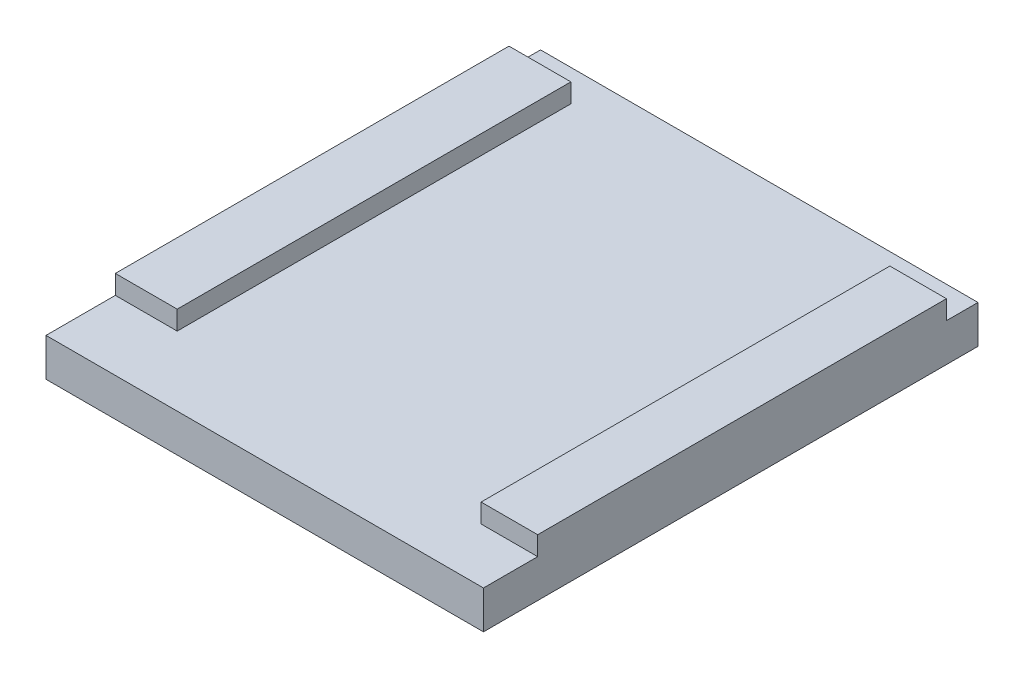
ISO-10303-21;
HEADER;
FILE_DESCRIPTION(('STEP AP214'),'2;1');
FILE_NAME('part.step','',(''),(''),'','','');
FILE_SCHEMA(('AUTOMOTIVE_DESIGN { 1 0 10303 214 1 1 1 1 }'));
ENDSEC;
DATA;
#1=APPLICATION_CONTEXT('core data for automotive mechanical design processes');
#2=APPLICATION_PROTOCOL_DEFINITION('international standard','automotive_design',2000,#1);
#3=PRODUCT_CONTEXT('',#1,'mechanical');
#4=PRODUCT('Part','Part','',(#3));
#5=PRODUCT_RELATED_PRODUCT_CATEGORY('part','',(#4));
#6=PRODUCT_DEFINITION_FORMATION('','',#4);
#7=PRODUCT_DEFINITION_CONTEXT('part definition',#1,'design');
#8=PRODUCT_DEFINITION('design','',#6,#7);
#9=PRODUCT_DEFINITION_SHAPE('','',#8);
#10=(LENGTH_UNIT() NAMED_UNIT(*) SI_UNIT(.MILLI.,.METRE.));
#11=(NAMED_UNIT(*) PLANE_ANGLE_UNIT() SI_UNIT($,.RADIAN.));
#12=(NAMED_UNIT(*) SI_UNIT($,.STERADIAN.) SOLID_ANGLE_UNIT());
#13=UNCERTAINTY_MEASURE_WITH_UNIT(LENGTH_MEASURE(1.E-05),#10,'distance_accuracy_value','');
#14=(GEOMETRIC_REPRESENTATION_CONTEXT(3) GLOBAL_UNCERTAINTY_ASSIGNED_CONTEXT((#13)) GLOBAL_UNIT_ASSIGNED_CONTEXT((#10,
#11,#12)) REPRESENTATION_CONTEXT('',''));
#15=CARTESIAN_POINT('',(0.,0.,0.));
#16=DIRECTION('',(0.,0.,1.));
#17=DIRECTION('',(1.,0.,0.));
#18=AXIS2_PLACEMENT_3D('',#15,#16,#17);
#19=CARTESIAN_POINT('',(0.,2.,0.));
#20=DIRECTION('',(0.,1.,0.));
#21=DIRECTION('',(0.,0.,1.));
#22=AXIS2_PLACEMENT_3D('',#19,#20,#21);
#23=PLANE('',#22);
#24=DIRECTION('',(0.,0.,1.));
#25=VECTOR('',#24,1.);
#26=CARTESIAN_POINT('',(20.0263343718205,2.,1.65880729446885));
#27=LINE('',#26,#25);
#28=CARTESIAN_POINT('',(20.0263343718205,2.,1.65880729446885));
#29=VERTEX_POINT('',#28);
#30=CARTESIAN_POINT('',(20.0263343718205,2.,23.1498418754959));
#31=VERTEX_POINT('',#30);
#32=EDGE_CURVE('E358',#29,#31,#27,.T.);
#33=ORIENTED_EDGE('',*,*,#32,.F.);
#34=DIRECTION('',(-1.,0.,0.));
#35=VECTOR('',#34,1.);
#36=CARTESIAN_POINT('',(23.,2.,1.65880729446885));
#37=LINE('',#36,#35);
#38=CARTESIAN_POINT('',(23.,2.,1.65880729446885));
#39=VERTEX_POINT('',#38);
#40=EDGE_CURVE('E364',#39,#29,#37,.T.);
#41=ORIENTED_EDGE('',*,*,#40,.F.);
#42=DIRECTION('',(0.,0.,-1.));
#43=VECTOR('',#42,1.);
#44=CARTESIAN_POINT('',(23.,2.,0.));
#45=LINE('',#44,#43);
#46=CARTESIAN_POINT('',(23.,2.,0.));
#47=VERTEX_POINT('',#46);
#48=EDGE_CURVE('E146',#39,#47,#45,.T.);
#49=ORIENTED_EDGE('',*,*,#48,.T.);
#50=DIRECTION('',(-1.,0.,0.));
#51=VECTOR('',#50,1.);
#52=CARTESIAN_POINT('',(0.,2.,0.));
#53=LINE('',#52,#51);
#54=CARTESIAN_POINT('',(0.,2.,0.));
#55=VERTEX_POINT('',#54);
#56=EDGE_CURVE('E187',#47,#55,#53,.T.);
#57=ORIENTED_EDGE('',*,*,#56,.T.);
#58=DIRECTION('',(0.,0.,1.));
#59=VECTOR('',#58,1.);
#60=CARTESIAN_POINT('',(0.,2.,0.));
#61=LINE('',#60,#59);
#62=CARTESIAN_POINT('',(0.,2.,1.65880729446884));
#63=VERTEX_POINT('',#62);
#64=EDGE_CURVE('E179',#55,#63,#61,.T.);
#65=ORIENTED_EDGE('',*,*,#64,.T.);
#66=DIRECTION('',(-1.,0.,0.));
#67=VECTOR('',#66,1.);
#68=CARTESIAN_POINT('',(0.,2.,1.65880729446885));
#69=LINE('',#68,#67);
#70=CARTESIAN_POINT('',(3.2539834705407,2.,1.65880729446885));
#71=VERTEX_POINT('',#70);
#72=EDGE_CURVE('E56',#71,#63,#69,.T.);
#73=ORIENTED_EDGE('',*,*,#72,.F.);
#74=DIRECTION('',(0.,0.,-1.));
#75=VECTOR('',#74,1.);
#76=CARTESIAN_POINT('',(3.2539834705407,2.,1.65880729446885));
#77=LINE('',#76,#75);
#78=CARTESIAN_POINT('',(3.2539834705407,2.,22.3556079888058));
#79=VERTEX_POINT('',#78);
#80=EDGE_CURVE('E150',#79,#71,#77,.T.);
#81=ORIENTED_EDGE('',*,*,#80,.F.);
#82=DIRECTION('',(1.,0.,0.));
#83=VECTOR('',#82,1.);
#84=CARTESIAN_POINT('',(0.,2.,22.3556079888058));
#85=LINE('',#84,#83);
#86=CARTESIAN_POINT('',(0.,2.,22.3556079888058));
#87=VERTEX_POINT('',#86);
#88=EDGE_CURVE('E147',#87,#79,#85,.T.);
#89=ORIENTED_EDGE('',*,*,#88,.F.);
#90=CARTESIAN_POINT('',(0.,2.,26.));
#91=VERTEX_POINT('',#90);
#92=EDGE_CURVE('E182',#87,#91,#61,.T.);
#93=ORIENTED_EDGE('',*,*,#92,.T.);
#94=DIRECTION('',(1.,0.,0.));
#95=VECTOR('',#94,1.);
#96=CARTESIAN_POINT('',(0.,2.,26.));
#97=LINE('',#96,#95);
#98=CARTESIAN_POINT('',(23.,2.,26.));
#99=VERTEX_POINT('',#98);
#100=EDGE_CURVE('E181',#91,#99,#97,.T.);
#101=ORIENTED_EDGE('',*,*,#100,.T.);
#102=CARTESIAN_POINT('',(23.,2.,23.1498418754959));
#103=VERTEX_POINT('',#102);
#104=EDGE_CURVE('E184',#99,#103,#45,.T.);
#105=ORIENTED_EDGE('',*,*,#104,.T.);
#106=DIRECTION('',(1.,0.,0.));
#107=VECTOR('',#106,1.);
#108=CARTESIAN_POINT('',(23.,2.,23.1498418754959));
#109=LINE('',#108,#107);
#110=EDGE_CURVE('E141',#31,#103,#109,.T.);
#111=ORIENTED_EDGE('',*,*,#110,.F.);
#112=EDGE_LOOP('',(#33,#41,#49,#57,#65,#73,#81,#89,#93,#101,#105,#111));
#113=FACE_BOUND('',#112,.T.);
#114=ADVANCED_FACE('F33',(#113),#23,.T.);
#115=CARTESIAN_POINT('',(0.,2.,0.));
#116=DIRECTION('',(1.,0.,0.));
#117=DIRECTION('',(0.,0.,-1.));
#118=AXIS2_PLACEMENT_3D('',#115,#116,#117);
#119=PLANE('',#118);
#120=DIRECTION('',(0.,0.,1.));
#121=VECTOR('',#120,1.);
#122=CARTESIAN_POINT('',(0.,0.,0.));
#123=LINE('',#122,#121);
#124=CARTESIAN_POINT('',(0.,0.,0.));
#125=VERTEX_POINT('',#124);
#126=CARTESIAN_POINT('',(0.,0.,26.));
#127=VERTEX_POINT('',#126);
#128=EDGE_CURVE('E178',#125,#127,#123,.T.);
#129=ORIENTED_EDGE('',*,*,#128,.T.);
#130=DIRECTION('',(0.,-1.,0.));
#131=VECTOR('',#130,1.);
#132=CARTESIAN_POINT('',(0.,2.,26.));
#133=LINE('',#132,#131);
#134=EDGE_CURVE('E11',#91,#127,#133,.T.);
#135=ORIENTED_EDGE('',*,*,#134,.F.);
#136=ORIENTED_EDGE('',*,*,#92,.F.);
#137=DIRECTION('',(0.,-1.,0.));
#138=VECTOR('',#137,1.);
#139=CARTESIAN_POINT('',(0.,3.,22.3556079888058));
#140=LINE('',#139,#138);
#141=CARTESIAN_POINT('',(0.,3.,22.3556079888058));
#142=VERTEX_POINT('',#141);
#143=EDGE_CURVE('E175',#142,#87,#140,.T.);
#144=ORIENTED_EDGE('',*,*,#143,.F.);
#145=DIRECTION('',(0.,0.,1.));
#146=VECTOR('',#145,1.);
#147=CARTESIAN_POINT('',(0.,3.,1.65880729446885));
#148=LINE('',#147,#146);
#149=CARTESIAN_POINT('',(0.,3.,1.65880729446885));
#150=VERTEX_POINT('',#149);
#151=EDGE_CURVE('E155',#150,#142,#148,.T.);
#152=ORIENTED_EDGE('',*,*,#151,.F.);
#153=DIRECTION('',(0.,-1.,0.));
#154=VECTOR('',#153,1.);
#155=CARTESIAN_POINT('',(0.,3.,1.65880729446885));
#156=LINE('',#155,#154);
#157=EDGE_CURVE('E163',#150,#63,#156,.T.);
#158=ORIENTED_EDGE('',*,*,#157,.T.);
#159=ORIENTED_EDGE('',*,*,#64,.F.);
#160=DIRECTION('',(0.,-1.,0.));
#161=VECTOR('',#160,1.);
#162=CARTESIAN_POINT('',(0.,2.,0.));
#163=LINE('',#162,#161);
#164=EDGE_CURVE('E189',#55,#125,#163,.T.);
#165=ORIENTED_EDGE('',*,*,#164,.T.);
#166=EDGE_LOOP('',(#129,#135,#136,#144,#152,#158,#159,#165));
#167=FACE_BOUND('',#166,.T.);
#168=ADVANCED_FACE('F35',(#167),#119,.F.);
#169=CARTESIAN_POINT('',(0.,2.,26.));
#170=DIRECTION('',(0.,0.,-1.));
#171=DIRECTION('',(-1.,0.,0.));
#172=AXIS2_PLACEMENT_3D('',#169,#170,#171);
#173=PLANE('',#172);
#174=DIRECTION('',(1.,0.,0.));
#175=VECTOR('',#174,1.);
#176=CARTESIAN_POINT('',(0.,0.,26.));
#177=LINE('',#176,#175);
#178=CARTESIAN_POINT('',(23.,0.,26.));
#179=VERTEX_POINT('',#178);
#180=EDGE_CURVE('E192',#127,#179,#177,.T.);
#181=ORIENTED_EDGE('',*,*,#180,.T.);
#182=DIRECTION('',(0.,-1.,0.));
#183=VECTOR('',#182,1.);
#184=CARTESIAN_POINT('',(23.,2.,26.));
#185=LINE('',#184,#183);
#186=EDGE_CURVE('E41',#99,#179,#185,.T.);
#187=ORIENTED_EDGE('',*,*,#186,.F.);
#188=ORIENTED_EDGE('',*,*,#100,.F.);
#189=ORIENTED_EDGE('',*,*,#134,.T.);
#190=EDGE_LOOP('',(#181,#187,#188,#189));
#191=FACE_BOUND('',#190,.T.);
#192=ADVANCED_FACE('F234',(#191),#173,.F.);
#193=CARTESIAN_POINT('',(23.,2.,0.));
#194=DIRECTION('',(-1.,0.,0.));
#195=DIRECTION('',(0.,0.,1.));
#196=AXIS2_PLACEMENT_3D('',#193,#194,#195);
#197=PLANE('',#196);
#198=DIRECTION('',(0.,0.,-1.));
#199=VECTOR('',#198,1.);
#200=CARTESIAN_POINT('',(23.,0.,0.));
#201=LINE('',#200,#199);
#202=CARTESIAN_POINT('',(23.,0.,0.));
#203=VERTEX_POINT('',#202);
#204=EDGE_CURVE('E194',#179,#203,#201,.T.);
#205=ORIENTED_EDGE('',*,*,#204,.T.);
#206=DIRECTION('',(0.,-1.,0.));
#207=VECTOR('',#206,1.);
#208=CARTESIAN_POINT('',(23.,2.,0.));
#209=LINE('',#208,#207);
#210=EDGE_CURVE('E200',#47,#203,#209,.T.);
#211=ORIENTED_EDGE('',*,*,#210,.F.);
#212=ORIENTED_EDGE('',*,*,#48,.F.);
#213=DIRECTION('',(0.,-1.,0.));
#214=VECTOR('',#213,1.);
#215=CARTESIAN_POINT('',(23.,3.,1.65880729446885));
#216=LINE('',#215,#214);
#217=CARTESIAN_POINT('',(23.,3.,1.65880729446885));
#218=VERTEX_POINT('',#217);
#219=EDGE_CURVE('E126',#218,#39,#216,.T.);
#220=ORIENTED_EDGE('',*,*,#219,.F.);
#221=DIRECTION('',(0.,0.,-1.));
#222=VECTOR('',#221,1.);
#223=CARTESIAN_POINT('',(23.,3.,1.65880729446885));
#224=LINE('',#223,#222);
#225=CARTESIAN_POINT('',(23.,3.,23.1498418754959));
#226=VERTEX_POINT('',#225);
#227=EDGE_CURVE('E133',#226,#218,#224,.T.);
#228=ORIENTED_EDGE('',*,*,#227,.F.);
#229=DIRECTION('',(0.,-1.,0.));
#230=VECTOR('',#229,1.);
#231=CARTESIAN_POINT('',(23.,3.,23.1498418754959));
#232=LINE('',#231,#230);
#233=EDGE_CURVE('E357',#226,#103,#232,.T.);
#234=ORIENTED_EDGE('',*,*,#233,.T.);
#235=ORIENTED_EDGE('',*,*,#104,.F.);
#236=ORIENTED_EDGE('',*,*,#186,.T.);
#237=EDGE_LOOP('',(#205,#211,#212,#220,#228,#234,#235,#236));
#238=FACE_BOUND('',#237,.T.);
#239=ADVANCED_FACE('F144',(#238),#197,.F.);
#240=CARTESIAN_POINT('',(0.,2.,0.));
#241=DIRECTION('',(0.,0.,1.));
#242=DIRECTION('',(1.,0.,0.));
#243=AXIS2_PLACEMENT_3D('',#240,#241,#242);
#244=PLANE('',#243);
#245=DIRECTION('',(-1.,0.,0.));
#246=VECTOR('',#245,1.);
#247=CARTESIAN_POINT('',(0.,0.,0.));
#248=LINE('',#247,#246);
#249=EDGE_CURVE('E196',#203,#125,#248,.T.);
#250=ORIENTED_EDGE('',*,*,#249,.T.);
#251=ORIENTED_EDGE('',*,*,#164,.F.);
#252=ORIENTED_EDGE('',*,*,#56,.F.);
#253=ORIENTED_EDGE('',*,*,#210,.T.);
#254=EDGE_LOOP('',(#250,#251,#252,#253));
#255=FACE_BOUND('',#254,.T.);
#256=ADVANCED_FACE('F214',(#255),#244,.F.);
#257=CARTESIAN_POINT('',(0.,0.,0.));
#258=DIRECTION('',(0.,1.,0.));
#259=DIRECTION('',(0.,0.,1.));
#260=AXIS2_PLACEMENT_3D('',#257,#258,#259);
#261=PLANE('',#260);
#262=ORIENTED_EDGE('',*,*,#128,.F.);
#263=ORIENTED_EDGE('',*,*,#249,.F.);
#264=ORIENTED_EDGE('',*,*,#204,.F.);
#265=ORIENTED_EDGE('',*,*,#180,.F.);
#266=EDGE_LOOP('',(#262,#263,#264,#265));
#267=FACE_BOUND('',#266,.T.);
#268=ADVANCED_FACE('F211',(#267),#261,.F.);
#269=CARTESIAN_POINT('',(0.,3.,22.3556079888058));
#270=DIRECTION('',(0.,0.,-1.));
#271=DIRECTION('',(-1.,0.,0.));
#272=AXIS2_PLACEMENT_3D('',#269,#270,#271);
#273=PLANE('',#272);
#274=ORIENTED_EDGE('',*,*,#88,.T.);
#275=DIRECTION('',(0.,-1.,0.));
#276=VECTOR('',#275,1.);
#277=CARTESIAN_POINT('',(3.2539834705407,3.,22.3556079888058));
#278=LINE('',#277,#276);
#279=CARTESIAN_POINT('',(3.2539834705407,3.,22.3556079888058));
#280=VERTEX_POINT('',#279);
#281=EDGE_CURVE('E172',#280,#79,#278,.T.);
#282=ORIENTED_EDGE('',*,*,#281,.F.);
#283=DIRECTION('',(1.,0.,0.));
#284=VECTOR('',#283,1.);
#285=CARTESIAN_POINT('',(0.,3.,22.3556079888058));
#286=LINE('',#285,#284);
#287=EDGE_CURVE('E158',#142,#280,#286,.T.);
#288=ORIENTED_EDGE('',*,*,#287,.F.);
#289=ORIENTED_EDGE('',*,*,#143,.T.);
#290=EDGE_LOOP('',(#274,#282,#288,#289));
#291=FACE_BOUND('',#290,.T.);
#292=ADVANCED_FACE('F232',(#291),#273,.F.);
#293=CARTESIAN_POINT('',(3.2539834705407,3.,1.65880729446885));
#294=DIRECTION('',(-1.,0.,0.));
#295=DIRECTION('',(0.,0.,1.));
#296=AXIS2_PLACEMENT_3D('',#293,#294,#295);
#297=PLANE('',#296);
#298=ORIENTED_EDGE('',*,*,#80,.T.);
#299=DIRECTION('',(0.,-1.,0.));
#300=VECTOR('',#299,1.);
#301=CARTESIAN_POINT('',(3.2539834705407,3.,1.65880729446885));
#302=LINE('',#301,#300);
#303=CARTESIAN_POINT('',(3.2539834705407,3.,1.65880729446885));
#304=VERTEX_POINT('',#303);
#305=EDGE_CURVE('E169',#304,#71,#302,.T.);
#306=ORIENTED_EDGE('',*,*,#305,.F.);
#307=DIRECTION('',(0.,0.,-1.));
#308=VECTOR('',#307,1.);
#309=CARTESIAN_POINT('',(3.2539834705407,3.,1.65880729446885));
#310=LINE('',#309,#308);
#311=EDGE_CURVE('E160',#280,#304,#310,.T.);
#312=ORIENTED_EDGE('',*,*,#311,.F.);
#313=ORIENTED_EDGE('',*,*,#281,.T.);
#314=EDGE_LOOP('',(#298,#306,#312,#313));
#315=FACE_BOUND('',#314,.T.);
#316=ADVANCED_FACE('F228',(#315),#297,.F.);
#317=CARTESIAN_POINT('',(0.,3.,1.65880729446885));
#318=DIRECTION('',(0.,0.,1.));
#319=DIRECTION('',(1.,0.,0.));
#320=AXIS2_PLACEMENT_3D('',#317,#318,#319);
#321=PLANE('',#320);
#322=ORIENTED_EDGE('',*,*,#72,.T.);
#323=ORIENTED_EDGE('',*,*,#157,.F.);
#324=DIRECTION('',(-1.,0.,0.));
#325=VECTOR('',#324,1.);
#326=CARTESIAN_POINT('',(0.,3.,1.65880729446885));
#327=LINE('',#326,#325);
#328=EDGE_CURVE('E162',#304,#150,#327,.T.);
#329=ORIENTED_EDGE('',*,*,#328,.F.);
#330=ORIENTED_EDGE('',*,*,#305,.T.);
#331=EDGE_LOOP('',(#322,#323,#329,#330));
#332=FACE_BOUND('',#331,.T.);
#333=ADVANCED_FACE('F223',(#332),#321,.F.);
#334=CARTESIAN_POINT('',(0.,3.,0.));
#335=DIRECTION('',(0.,1.,0.));
#336=DIRECTION('',(0.,0.,1.));
#337=AXIS2_PLACEMENT_3D('',#334,#335,#336);
#338=PLANE('',#337);
#339=ORIENTED_EDGE('',*,*,#151,.T.);
#340=ORIENTED_EDGE('',*,*,#287,.T.);
#341=ORIENTED_EDGE('',*,*,#311,.T.);
#342=ORIENTED_EDGE('',*,*,#328,.T.);
#343=EDGE_LOOP('',(#339,#340,#341,#342));
#344=FACE_BOUND('',#343,.T.);
#345=ADVANCED_FACE('F275',(#344),#338,.T.);
#346=CARTESIAN_POINT('',(23.,3.,1.65880729446885));
#347=DIRECTION('',(0.,0.,1.));
#348=DIRECTION('',(1.,0.,0.));
#349=AXIS2_PLACEMENT_3D('',#346,#347,#348);
#350=PLANE('',#349);
#351=ORIENTED_EDGE('',*,*,#40,.T.);
#352=DIRECTION('',(0.,-1.,0.));
#353=VECTOR('',#352,1.);
#354=CARTESIAN_POINT('',(20.0263343718205,3.,1.65880729446885));
#355=LINE('',#354,#353);
#356=CARTESIAN_POINT('',(20.0263343718205,3.,1.65880729446885));
#357=VERTEX_POINT('',#356);
#358=EDGE_CURVE('E129',#357,#29,#355,.T.);
#359=ORIENTED_EDGE('',*,*,#358,.F.);
#360=DIRECTION('',(-1.,0.,0.));
#361=VECTOR('',#360,1.);
#362=CARTESIAN_POINT('',(23.,3.,1.65880729446885));
#363=LINE('',#362,#361);
#364=EDGE_CURVE('E122',#218,#357,#363,.T.);
#365=ORIENTED_EDGE('',*,*,#364,.F.);
#366=ORIENTED_EDGE('',*,*,#219,.T.);
#367=EDGE_LOOP('',(#351,#359,#365,#366));
#368=FACE_BOUND('',#367,.T.);
#369=ADVANCED_FACE('F124',(#368),#350,.F.);
#370=CARTESIAN_POINT('',(20.0263343718205,3.,1.65880729446885));
#371=DIRECTION('',(1.,0.,0.));
#372=DIRECTION('',(0.,0.,-1.));
#373=AXIS2_PLACEMENT_3D('',#370,#371,#372);
#374=PLANE('',#373);
#375=ORIENTED_EDGE('',*,*,#32,.T.);
#376=DIRECTION('',(0.,-1.,0.));
#377=VECTOR('',#376,1.);
#378=CARTESIAN_POINT('',(20.0263343718205,3.,23.1498418754959));
#379=LINE('',#378,#377);
#380=CARTESIAN_POINT('',(20.0263343718205,3.,23.1498418754959));
#381=VERTEX_POINT('',#380);
#382=EDGE_CURVE('E48',#381,#31,#379,.T.);
#383=ORIENTED_EDGE('',*,*,#382,.F.);
#384=DIRECTION('',(0.,0.,1.));
#385=VECTOR('',#384,1.);
#386=CARTESIAN_POINT('',(20.0263343718205,3.,1.65880729446885));
#387=LINE('',#386,#385);
#388=EDGE_CURVE('E132',#357,#381,#387,.T.);
#389=ORIENTED_EDGE('',*,*,#388,.F.);
#390=ORIENTED_EDGE('',*,*,#358,.T.);
#391=EDGE_LOOP('',(#375,#383,#389,#390));
#392=FACE_BOUND('',#391,.T.);
#393=ADVANCED_FACE('F289',(#392),#374,.F.);
#394=CARTESIAN_POINT('',(23.,3.,23.1498418754959));
#395=DIRECTION('',(0.,0.,-1.));
#396=DIRECTION('',(-1.,0.,0.));
#397=AXIS2_PLACEMENT_3D('',#394,#395,#396);
#398=PLANE('',#397);
#399=ORIENTED_EDGE('',*,*,#110,.T.);
#400=ORIENTED_EDGE('',*,*,#233,.F.);
#401=DIRECTION('',(1.,0.,0.));
#402=VECTOR('',#401,1.);
#403=CARTESIAN_POINT('',(23.,3.,23.1498418754959));
#404=LINE('',#403,#402);
#405=EDGE_CURVE('E137',#381,#226,#404,.T.);
#406=ORIENTED_EDGE('',*,*,#405,.F.);
#407=ORIENTED_EDGE('',*,*,#382,.T.);
#408=EDGE_LOOP('',(#399,#400,#406,#407));
#409=FACE_BOUND('',#408,.T.);
#410=ADVANCED_FACE('F296',(#409),#398,.F.);
#411=CARTESIAN_POINT('',(0.,3.,0.));
#412=DIRECTION('',(0.,-1.,0.));
#413=DIRECTION('',(0.,0.,-1.));
#414=AXIS2_PLACEMENT_3D('',#411,#412,#413);
#415=PLANE('',#414);
#416=ORIENTED_EDGE('',*,*,#227,.T.);
#417=ORIENTED_EDGE('',*,*,#364,.T.);
#418=ORIENTED_EDGE('',*,*,#388,.T.);
#419=ORIENTED_EDGE('',*,*,#405,.T.);
#420=EDGE_LOOP('',(#416,#417,#418,#419));
#421=FACE_BOUND('',#420,.T.);
#422=ADVANCED_FACE('F136',(#421),#415,.F.);
#423=CLOSED_SHELL('',(#114,#168,#192,#239,#256,#268,#292,#316,#333,#345,#369,#393,#410,#422));
#424=MANIFOLD_SOLID_BREP('B2',#423);
#425=ADVANCED_BREP_SHAPE_REPRESENTATION('',(#18,#424),#14);
#426=SHAPE_DEFINITION_REPRESENTATION(#9,#425);
ENDSEC;
END-ISO-10303-21;
